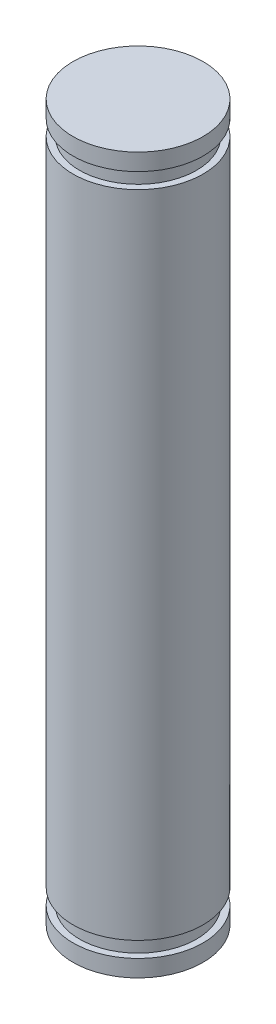
ISO-10303-21;
HEADER;
FILE_DESCRIPTION(('STEP AP214'),'2;1');
FILE_NAME('part.step','',(''),(''),'','','');
FILE_SCHEMA(('AUTOMOTIVE_DESIGN { 1 0 10303 214 1 1 1 1 }'));
ENDSEC;
DATA;
#1=APPLICATION_CONTEXT('core data for automotive mechanical design processes');
#2=APPLICATION_PROTOCOL_DEFINITION('international standard','automotive_design',2000,#1);
#3=PRODUCT_CONTEXT('',#1,'mechanical');
#4=PRODUCT('Part','Part','',(#3));
#5=PRODUCT_RELATED_PRODUCT_CATEGORY('part','',(#4));
#6=PRODUCT_DEFINITION_FORMATION('','',#4);
#7=PRODUCT_DEFINITION_CONTEXT('part definition',#1,'design');
#8=PRODUCT_DEFINITION('design','',#6,#7);
#9=PRODUCT_DEFINITION_SHAPE('','',#8);
#10=(LENGTH_UNIT() NAMED_UNIT(*) SI_UNIT(.MILLI.,.METRE.));
#11=(NAMED_UNIT(*) PLANE_ANGLE_UNIT() SI_UNIT($,.RADIAN.));
#12=(NAMED_UNIT(*) SI_UNIT($,.STERADIAN.) SOLID_ANGLE_UNIT());
#13=UNCERTAINTY_MEASURE_WITH_UNIT(LENGTH_MEASURE(1.E-05),#10,'distance_accuracy_value','');
#14=(GEOMETRIC_REPRESENTATION_CONTEXT(3) GLOBAL_UNCERTAINTY_ASSIGNED_CONTEXT((#13)) GLOBAL_UNIT_ASSIGNED_CONTEXT((#10,
#11,#12)) REPRESENTATION_CONTEXT('',''));
#15=CARTESIAN_POINT('',(0.,0.,0.));
#16=DIRECTION('',(0.,0.,1.));
#17=DIRECTION('',(1.,0.,0.));
#18=AXIS2_PLACEMENT_3D('',#15,#16,#17);
#19=CARTESIAN_POINT('',(-11.955644483101,21.1149363933196,0.));
#20=DIRECTION('',(0.,-1.,0.));
#21=DIRECTION('',(0.,0.,-1.));
#22=AXIS2_PLACEMENT_3D('',#19,#20,#21);
#23=CYLINDRICAL_SURFACE('',#22,5.);
#24=CARTESIAN_POINT('',(-11.955644483101,22.4149363933196,0.));
#25=DIRECTION('',(0.,-1.,0.));
#26=DIRECTION('',(0.,0.,-1.));
#27=AXIS2_PLACEMENT_3D('',#24,#25,#26);
#28=CIRCLE('',#27,5.);
#29=CARTESIAN_POINT('',(-11.955644483101,22.4149363933196,-5.));
#30=VERTEX_POINT('',#29);
#31=EDGE_CURVE('E10',#30,#30,#28,.T.);
#32=ORIENTED_EDGE('',*,*,#31,.T.);
#33=EDGE_LOOP('',(#32));
#34=FACE_BOUND('',#33,.T.);
#35=CARTESIAN_POINT('',(-11.955644483101,21.1149363933196,0.));
#36=DIRECTION('',(0.,-1.,0.));
#37=DIRECTION('',(0.,0.,-1.));
#38=AXIS2_PLACEMENT_3D('',#35,#36,#37);
#39=CIRCLE('',#38,5.);
#40=CARTESIAN_POINT('',(-11.955644483101,21.1149363933196,-5.));
#41=VERTEX_POINT('',#40);
#42=EDGE_CURVE('E80',#41,#41,#39,.T.);
#43=ORIENTED_EDGE('',*,*,#42,.F.);
#44=EDGE_LOOP('',(#43));
#45=FACE_BOUND('',#44,.T.);
#46=ADVANCED_FACE('F37',(#34,#45),#23,.T.);
#47=CARTESIAN_POINT('',(-6.95564448310102,22.4149363933196,0.));
#48=DIRECTION('',(0.,1.,0.));
#49=DIRECTION('',(0.,0.,1.));
#50=AXIS2_PLACEMENT_3D('',#47,#48,#49);
#51=PLANE('',#50);
#52=CARTESIAN_POINT('',(-11.955644483101,22.4149363933196,0.));
#53=DIRECTION('',(0.,-1.,0.));
#54=DIRECTION('',(0.,0.,-1.));
#55=AXIS2_PLACEMENT_3D('',#52,#53,#54);
#56=CIRCLE('',#55,4.5);
#57=CARTESIAN_POINT('',(-11.955644483101,22.4149363933196,-4.5));
#58=VERTEX_POINT('',#57);
#59=EDGE_CURVE('E44',#58,#58,#56,.T.);
#60=ORIENTED_EDGE('',*,*,#59,.T.);
#61=EDGE_LOOP('',(#60));
#62=FACE_BOUND('',#61,.T.);
#63=ORIENTED_EDGE('',*,*,#31,.F.);
#64=EDGE_LOOP('',(#63));
#65=FACE_BOUND('',#64,.T.);
#66=ADVANCED_FACE('F88',(#62,#65),#51,.T.);
#67=CARTESIAN_POINT('',(-11.955644483101,21.1149363933196,0.));
#68=DIRECTION('',(0.,-1.,0.));
#69=DIRECTION('',(0.,0.,-1.));
#70=AXIS2_PLACEMENT_3D('',#67,#68,#69);
#71=CYLINDRICAL_SURFACE('',#70,4.5);
#72=CARTESIAN_POINT('',(-11.955644483101,23.6149363933196,0.));
#73=DIRECTION('',(0.,-1.,0.));
#74=DIRECTION('',(0.,0.,-1.));
#75=AXIS2_PLACEMENT_3D('',#72,#73,#74);
#76=CIRCLE('',#75,4.5);
#77=CARTESIAN_POINT('',(-11.955644483101,23.6149363933196,-4.5));
#78=VERTEX_POINT('',#77);
#79=EDGE_CURVE('E49',#78,#78,#76,.T.);
#80=ORIENTED_EDGE('',*,*,#79,.T.);
#81=EDGE_LOOP('',(#80));
#82=FACE_BOUND('',#81,.T.);
#83=ORIENTED_EDGE('',*,*,#59,.F.);
#84=EDGE_LOOP('',(#83));
#85=FACE_BOUND('',#84,.T.);
#86=ADVANCED_FACE('F92',(#82,#85),#71,.T.);
#87=CARTESIAN_POINT('',(-7.45564448310102,23.6149363933196,0.));
#88=DIRECTION('',(0.,-1.,0.));
#89=DIRECTION('',(0.,0.,-1.));
#90=AXIS2_PLACEMENT_3D('',#87,#88,#89);
#91=PLANE('',#90);
#92=CARTESIAN_POINT('',(-11.955644483101,23.6149363933196,0.));
#93=DIRECTION('',(0.,-1.,0.));
#94=DIRECTION('',(0.,0.,-1.));
#95=AXIS2_PLACEMENT_3D('',#92,#93,#94);
#96=CIRCLE('',#95,5.);
#97=CARTESIAN_POINT('',(-11.955644483101,23.6149363933196,-5.));
#98=VERTEX_POINT('',#97);
#99=EDGE_CURVE('E54',#98,#98,#96,.T.);
#100=ORIENTED_EDGE('',*,*,#99,.T.);
#101=EDGE_LOOP('',(#100));
#102=FACE_BOUND('',#101,.T.);
#103=ORIENTED_EDGE('',*,*,#79,.F.);
#104=EDGE_LOOP('',(#103));
#105=FACE_BOUND('',#104,.T.);
#106=ADVANCED_FACE('F96',(#102,#105),#91,.T.);
#107=CARTESIAN_POINT('',(-11.955644483101,21.1149363933196,0.));
#108=DIRECTION('',(0.,-1.,0.));
#109=DIRECTION('',(0.,0.,-1.));
#110=AXIS2_PLACEMENT_3D('',#107,#108,#109);
#111=CYLINDRICAL_SURFACE('',#110,5.);
#112=CARTESIAN_POINT('',(-11.955644483101,73.6149363933196,0.));
#113=DIRECTION('',(0.,-1.,0.));
#114=DIRECTION('',(0.,0.,-1.));
#115=AXIS2_PLACEMENT_3D('',#112,#113,#114);
#116=CIRCLE('',#115,5.);
#117=CARTESIAN_POINT('',(-11.955644483101,73.6149363933196,-5.));
#118=VERTEX_POINT('',#117);
#119=EDGE_CURVE('E60',#118,#118,#116,.T.);
#120=ORIENTED_EDGE('',*,*,#119,.T.);
#121=EDGE_LOOP('',(#120));
#122=FACE_BOUND('',#121,.T.);
#123=ORIENTED_EDGE('',*,*,#99,.F.);
#124=EDGE_LOOP('',(#123));
#125=FACE_BOUND('',#124,.T.);
#126=ADVANCED_FACE('F103',(#122,#125),#111,.T.);
#127=CARTESIAN_POINT('',(-6.95564448310102,73.6149363933196,0.));
#128=DIRECTION('',(0.,1.,0.));
#129=DIRECTION('',(0.,0.,1.));
#130=AXIS2_PLACEMENT_3D('',#127,#128,#129);
#131=PLANE('',#130);
#132=CARTESIAN_POINT('',(-11.955644483101,73.6149363933196,0.));
#133=DIRECTION('',(0.,-1.,0.));
#134=DIRECTION('',(0.,0.,-1.));
#135=AXIS2_PLACEMENT_3D('',#132,#133,#134);
#136=CIRCLE('',#135,4.5);
#137=CARTESIAN_POINT('',(-11.955644483101,73.6149363933196,-4.5));
#138=VERTEX_POINT('',#137);
#139=EDGE_CURVE('E64',#138,#138,#136,.T.);
#140=ORIENTED_EDGE('',*,*,#139,.T.);
#141=EDGE_LOOP('',(#140));
#142=FACE_BOUND('',#141,.T.);
#143=ORIENTED_EDGE('',*,*,#119,.F.);
#144=EDGE_LOOP('',(#143));
#145=FACE_BOUND('',#144,.T.);
#146=ADVANCED_FACE('F107',(#142,#145),#131,.T.);
#147=CARTESIAN_POINT('',(-11.955644483101,21.1149363933196,0.));
#148=DIRECTION('',(0.,-1.,0.));
#149=DIRECTION('',(0.,0.,-1.));
#150=AXIS2_PLACEMENT_3D('',#147,#148,#149);
#151=CYLINDRICAL_SURFACE('',#150,4.5);
#152=CARTESIAN_POINT('',(-11.955644483101,74.8149363933196,0.));
#153=DIRECTION('',(0.,-1.,0.));
#154=DIRECTION('',(0.,0.,-1.));
#155=AXIS2_PLACEMENT_3D('',#152,#153,#154);
#156=CIRCLE('',#155,4.5);
#157=CARTESIAN_POINT('',(-11.955644483101,74.8149363933196,-4.5));
#158=VERTEX_POINT('',#157);
#159=EDGE_CURVE('E68',#158,#158,#156,.T.);
#160=ORIENTED_EDGE('',*,*,#159,.T.);
#161=EDGE_LOOP('',(#160));
#162=FACE_BOUND('',#161,.T.);
#163=ORIENTED_EDGE('',*,*,#139,.F.);
#164=EDGE_LOOP('',(#163));
#165=FACE_BOUND('',#164,.T.);
#166=ADVANCED_FACE('F111',(#162,#165),#151,.T.);
#167=CARTESIAN_POINT('',(-7.45564448310102,74.8149363933196,0.));
#168=DIRECTION('',(0.,-1.,0.));
#169=DIRECTION('',(0.,0.,-1.));
#170=AXIS2_PLACEMENT_3D('',#167,#168,#169);
#171=PLANE('',#170);
#172=CARTESIAN_POINT('',(-11.955644483101,74.8149363933196,0.));
#173=DIRECTION('',(0.,-1.,0.));
#174=DIRECTION('',(0.,0.,-1.));
#175=AXIS2_PLACEMENT_3D('',#172,#173,#174);
#176=CIRCLE('',#175,5.);
#177=CARTESIAN_POINT('',(-11.955644483101,74.8149363933196,-5.));
#178=VERTEX_POINT('',#177);
#179=EDGE_CURVE('E72',#178,#178,#176,.T.);
#180=ORIENTED_EDGE('',*,*,#179,.T.);
#181=EDGE_LOOP('',(#180));
#182=FACE_BOUND('',#181,.T.);
#183=ORIENTED_EDGE('',*,*,#159,.F.);
#184=EDGE_LOOP('',(#183));
#185=FACE_BOUND('',#184,.T.);
#186=ADVANCED_FACE('F115',(#182,#185),#171,.T.);
#187=CARTESIAN_POINT('',(-11.955644483101,21.1149363933196,0.));
#188=DIRECTION('',(0.,-1.,0.));
#189=DIRECTION('',(0.,0.,-1.));
#190=AXIS2_PLACEMENT_3D('',#187,#188,#189);
#191=CYLINDRICAL_SURFACE('',#190,5.);
#192=CARTESIAN_POINT('',(-11.955644483101,76.1149363933196,0.));
#193=DIRECTION('',(0.,-1.,0.));
#194=DIRECTION('',(0.,0.,-1.));
#195=AXIS2_PLACEMENT_3D('',#192,#193,#194);
#196=CIRCLE('',#195,5.);
#197=CARTESIAN_POINT('',(-11.955644483101,76.1149363933196,-5.));
#198=VERTEX_POINT('',#197);
#199=EDGE_CURVE('E76',#198,#198,#196,.T.);
#200=ORIENTED_EDGE('',*,*,#199,.T.);
#201=EDGE_LOOP('',(#200));
#202=FACE_BOUND('',#201,.T.);
#203=ORIENTED_EDGE('',*,*,#179,.F.);
#204=EDGE_LOOP('',(#203));
#205=FACE_BOUND('',#204,.T.);
#206=ADVANCED_FACE('F119',(#202,#205),#191,.T.);
#207=CARTESIAN_POINT('',(-6.95564448310102,76.1149363933196,0.));
#208=DIRECTION('',(0.,1.,0.));
#209=DIRECTION('',(0.,0.,1.));
#210=AXIS2_PLACEMENT_3D('',#207,#208,#209);
#211=PLANE('',#210);
#212=ORIENTED_EDGE('',*,*,#199,.F.);
#213=EDGE_LOOP('',(#212));
#214=FACE_BOUND('',#213,.T.);
#215=ADVANCED_FACE('F123',(#214),#211,.T.);
#216=CARTESIAN_POINT('',(-6.95564448310102,21.1149363933196,0.));
#217=DIRECTION('',(0.,-1.,0.));
#218=DIRECTION('',(0.,0.,-1.));
#219=AXIS2_PLACEMENT_3D('',#216,#217,#218);
#220=PLANE('',#219);
#221=ORIENTED_EDGE('',*,*,#42,.T.);
#222=EDGE_LOOP('',(#221));
#223=FACE_BOUND('',#222,.T.);
#224=ADVANCED_FACE('F85',(#223),#220,.T.);
#225=CLOSED_SHELL('',(#46,#66,#86,#106,#126,#146,#166,#186,#206,#215,#224));
#226=MANIFOLD_SOLID_BREP('B2',#225);
#227=ADVANCED_BREP_SHAPE_REPRESENTATION('',(#18,#226),#14);
#228=SHAPE_DEFINITION_REPRESENTATION(#9,#227);
ENDSEC;
END-ISO-10303-21;
